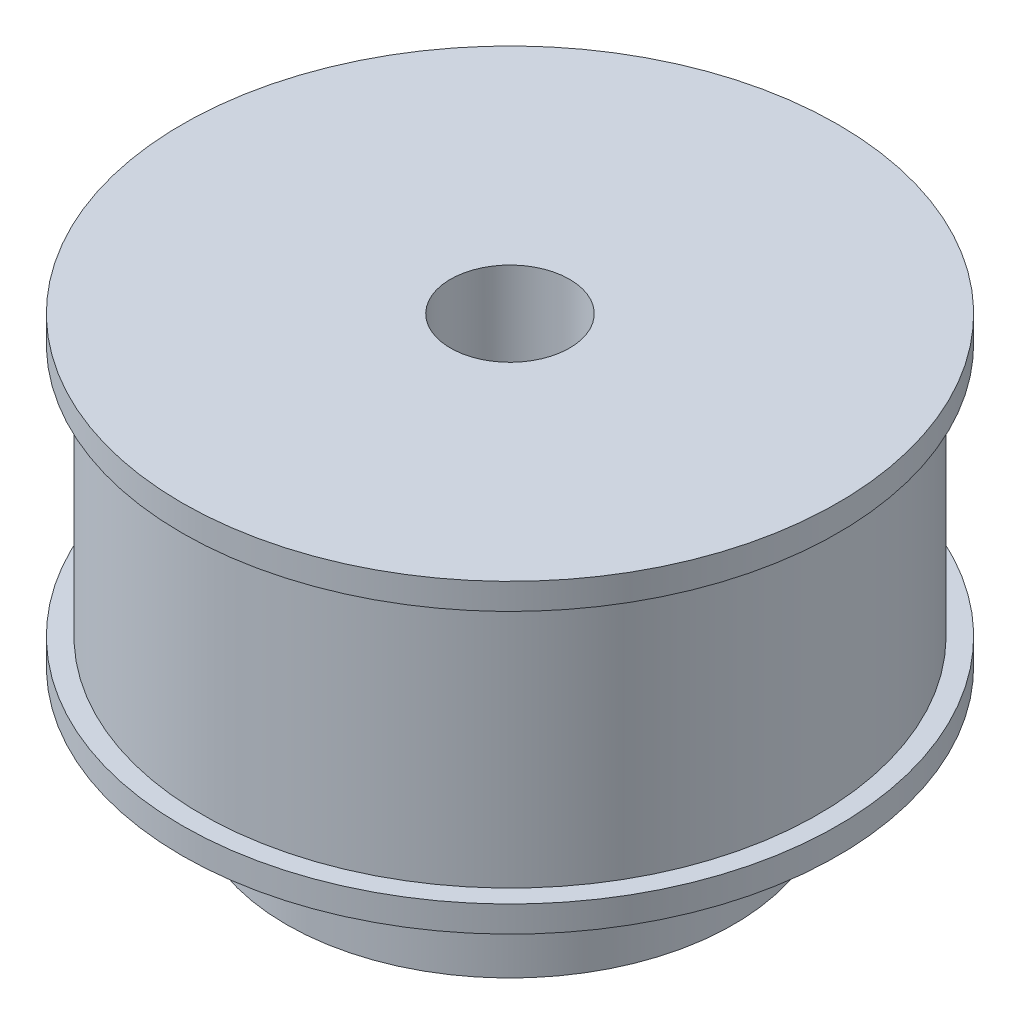
ISO-10303-21;
HEADER;
FILE_DESCRIPTION(('STEP AP214'),'2;1');
FILE_NAME('part.step','',(''),(''),'','','');
FILE_SCHEMA(('AUTOMOTIVE_DESIGN { 1 0 10303 214 1 1 1 1 }'));
ENDSEC;
DATA;
#1=APPLICATION_CONTEXT('core data for automotive mechanical design processes');
#2=APPLICATION_PROTOCOL_DEFINITION('international standard','automotive_design',2000,#1);
#3=PRODUCT_CONTEXT('',#1,'mechanical');
#4=PRODUCT('Part','Part','',(#3));
#5=PRODUCT_RELATED_PRODUCT_CATEGORY('part','',(#4));
#6=PRODUCT_DEFINITION_FORMATION('','',#4);
#7=PRODUCT_DEFINITION_CONTEXT('part definition',#1,'design');
#8=PRODUCT_DEFINITION('design','',#6,#7);
#9=PRODUCT_DEFINITION_SHAPE('','',#8);
#10=(LENGTH_UNIT() NAMED_UNIT(*) SI_UNIT(.MILLI.,.METRE.));
#11=(NAMED_UNIT(*) PLANE_ANGLE_UNIT() SI_UNIT($,.RADIAN.));
#12=(NAMED_UNIT(*) SI_UNIT($,.STERADIAN.) SOLID_ANGLE_UNIT());
#13=UNCERTAINTY_MEASURE_WITH_UNIT(LENGTH_MEASURE(1.E-05),#10,'distance_accuracy_value','');
#14=(GEOMETRIC_REPRESENTATION_CONTEXT(3) GLOBAL_UNCERTAINTY_ASSIGNED_CONTEXT((#13)) GLOBAL_UNIT_ASSIGNED_CONTEXT((#10,
#11,#12)) REPRESENTATION_CONTEXT('',''));
#15=CARTESIAN_POINT('',(0.,0.,0.));
#16=DIRECTION('',(0.,0.,1.));
#17=DIRECTION('',(1.,0.,0.));
#18=AXIS2_PLACEMENT_3D('',#15,#16,#17);
#19=CARTESIAN_POINT('',(0.,0.,0.));
#20=DIRECTION('',(0.,-1.,0.));
#21=DIRECTION('',(0.,0.,-1.));
#22=AXIS2_PLACEMENT_3D('',#19,#20,#21);
#23=CYLINDRICAL_SURFACE('',#22,4.);
#24=CARTESIAN_POINT('',(-3.46410161513775,3.75,-2.));
#25=CARTESIAN_POINT('',(-3.46411185715887,3.85421320547434,-1.99999158748781));
#26=CARTESIAN_POINT('',(-3.46887633544978,3.9585621765338,-1.99179963610437));
#27=CARTESIAN_POINT('',(-3.48724701669072,4.1640551772306,-1.95944672580053));
#28=CARTESIAN_POINT('',(-3.50087179788182,4.26519200324776,-1.93525221095662));
#29=CARTESIAN_POINT('',(-3.53498701490001,4.46090315644693,-1.8721998159803));
#30=CARTESIAN_POINT('',(-3.55544089069168,4.55550925884925,-1.83341988295963));
#31=CARTESIAN_POINT('',(-3.60085327291132,4.73684845047615,-1.74253507245138));
#32=CARTESIAN_POINT('',(-3.62581202301253,4.82358111343677,-1.69042947410139));
#33=CARTESIAN_POINT('',(-3.67993738819289,4.99461144313338,-1.569333074538));
#34=CARTESIAN_POINT('',(-3.70928127465103,5.07811826759177,-1.49930407053533));
#35=CARTESIAN_POINT('',(-3.76743965382121,5.2328167805706,-1.34650761698202));
#36=CARTESIAN_POINT('',(-3.79625387610258,5.30400232620397,-1.26373385204841));
#37=CARTESIAN_POINT('',(-3.85242953961661,5.4367343011885,-1.08097912631265));
#38=CARTESIAN_POINT('',(-3.87956212851245,5.49730753542331,-0.980214377887153));
#39=CARTESIAN_POINT('',(-3.92701512184167,5.60028170678709,-0.768314053336917));
#40=CARTESIAN_POINT('',(-3.94733982363631,5.6426941123508,-0.657185076311985));
#41=CARTESIAN_POINT('',(-3.97760922492053,5.70500932253118,-0.436089887818817));
#42=CARTESIAN_POINT('',(-3.98818960442739,5.7262990526921,-0.326603580968785));
#43=CARTESIAN_POINT('',(-4.00015167691179,5.75033223736903,-0.10514125740454));
#44=CARTESIAN_POINT('',(-4.00153893568934,5.75308691359628,0.00683321168520778));
#45=CARTESIAN_POINT('',(-3.99525963833124,5.74050665205486,0.219665048849573));
#46=CARTESIAN_POINT('',(-3.98836991784381,5.72672396895636,0.320642398354139));
#47=CARTESIAN_POINT('',(-3.96748490519435,5.68423831219188,0.518627543836089));
#48=CARTESIAN_POINT('',(-3.95348908132771,5.65553422204788,0.615635042187701));
#49=CARTESIAN_POINT('',(-3.91943166575325,5.58383486782005,0.804618783139259));
#50=CARTESIAN_POINT('',(-3.89928883058402,5.54064737365578,0.896506847030398));
#51=CARTESIAN_POINT('',(-3.8547529197337,5.4414731675971,1.07195360302662));
#52=CARTESIAN_POINT('',(-3.83035832314967,5.38548187339532,1.15550929767728));
#53=CARTESIAN_POINT('',(-3.77688788798459,5.25620929693394,1.3203473217964));
#54=CARTESIAN_POINT('',(-3.7475875199635,5.18179394334797,1.40066815005872));
#55=CARTESIAN_POINT('',(-3.68908681173623,5.02082055013965,1.54820874059556));
#56=CARTESIAN_POINT('',(-3.65988656531257,4.93425325545188,1.61541842314846));
#57=CARTESIAN_POINT('',(-3.60288312184969,4.74470361515182,1.73901066928442));
#58=CARTESIAN_POINT('',(-3.57528639981415,4.64102795389158,1.7944346299561));
#59=CARTESIAN_POINT('',(-3.52750900557151,4.424124657282,1.88663822600246));
#60=CARTESIAN_POINT('',(-3.50732060092135,4.31090713396487,1.92343731642178));
#61=CARTESIAN_POINT('',(-3.47889271634069,4.08757097743442,1.97436042205008));
#62=CARTESIAN_POINT('',(-3.46983311696993,3.9779177619129,1.99005024423995));
#63=CARTESIAN_POINT('',(-3.46235838723219,3.75719731696691,2.00303389322285));
#64=CARTESIAN_POINT('',(-3.46393573778623,3.6461311417604,2.00034071463005));
#65=CARTESIAN_POINT('',(-3.47668673081169,3.43869216284256,1.97807208668793));
#66=CARTESIAN_POINT('',(-3.48679175013308,3.34204109778421,1.96037563342492));
#67=CARTESIAN_POINT('',(-3.51388043102682,3.15326442745801,1.91139256926489));
#68=CARTESIAN_POINT('',(-3.53086632010068,3.06114029850652,1.88010155724727));
#69=CARTESIAN_POINT('',(-3.57072444159313,2.87917733819488,1.80329517720973));
#70=CARTESIAN_POINT('',(-3.59383286486125,2.78964196629395,1.7571881273853));
#71=CARTESIAN_POINT('',(-3.643122389945,2.61906145692096,1.65257412803176));
#72=CARTESIAN_POINT('',(-3.66930506710298,2.53802071296949,1.59406080866498));
#73=CARTESIAN_POINT('',(-3.72575996912669,2.37604246495734,1.45767433439709));
#74=CARTESIAN_POINT('',(-3.75613166308566,2.29640569858222,1.37829054462748));
#75=CARTESIAN_POINT('',(-3.81468469955797,2.15117552399527,1.20680899079904));
#76=CARTESIAN_POINT('',(-3.84286530015463,2.08558685947316,1.11470694931991));
#77=CARTESIAN_POINT('',(-3.89482723381867,1.96885254816729,0.917070725108058));
#78=CARTESIAN_POINT('',(-3.91847283343884,1.91813376383323,0.811246195112494));
#79=CARTESIAN_POINT('',(-3.95766709918776,1.83572419203039,0.591044729317865));
#80=CARTESIAN_POINT('',(-3.97322287353397,1.8040166963159,0.476675402917652));
#81=CARTESIAN_POINT('',(-3.99335016363174,1.76326287251486,0.253959364539763));
#82=CARTESIAN_POINT('',(-3.9987985581427,1.75240425133572,0.146022887268299));
#83=CARTESIAN_POINT('',(-4.00084260752374,1.74831346600433,-0.0702519714699464));
#84=CARTESIAN_POINT('',(-3.99744136141634,1.75507513147113,-0.178590198981615));
#85=CARTESIAN_POINT('',(-3.98267937668509,1.7848328243164,-0.385075986136859));
#86=CARTESIAN_POINT('',(-3.97185789309443,1.80672973730905,-0.483424641057419));
#87=CARTESIAN_POINT('',(-3.94384187353387,1.86465395980667,-0.674891898931565));
#88=CARTESIAN_POINT('',(-3.92664642364424,1.90068329570691,-0.768009749669772));
#89=CARTESIAN_POINT('',(-3.8865186139318,1.9874542549914,-0.950846833596741));
#90=CARTESIAN_POINT('',(-3.86337234005403,2.03875921975186,-1.0402503657229));
#91=CARTESIAN_POINT('',(-3.81376266676027,2.15391528811809,-1.20954920326828));
#92=CARTESIAN_POINT('',(-3.78729774583427,2.21777215410157,-1.28944011444319));
#93=CARTESIAN_POINT('',(-3.73057218840582,2.36359663555941,-1.44582833859495));
#94=CARTESIAN_POINT('',(-3.70019591726075,2.44673418080029,-1.52119665879199));
#95=CARTESIAN_POINT('',(-3.64126158628571,2.62489222830609,-1.65732528394006));
#96=CARTESIAN_POINT('',(-3.61270515130784,2.71992313136052,-1.71807266521244));
#97=CARTESIAN_POINT('',(-3.55999186256751,2.92330889413024,-1.82486714716811));
#98=CARTESIAN_POINT('',(-3.53600256268535,3.03198991073527,-1.87038902381914));
#99=CARTESIAN_POINT('',(-3.5069621813237,3.20057811963095,-1.92395929504801));
#100=CARTESIAN_POINT('',(-3.49844389329401,3.25764782059068,-1.93935666147967));
#101=CARTESIAN_POINT('',(-3.48406059323535,3.37323255750019,-1.96508069805043));
#102=CARTESIAN_POINT('',(-3.4781937263605,3.43174655275425,-1.97541091343282));
#103=CARTESIAN_POINT('',(-3.47059023668758,3.53360078924729,-1.9887293296122));
#104=CARTESIAN_POINT('',(-3.46816389731815,3.57673305725007,-1.99295091983786));
#105=CARTESIAN_POINT('',(-3.46491740045177,3.6632356930929,-1.99858810035606));
#106=CARTESIAN_POINT('',(-3.46409735040492,3.7066060766667,-2.00000350293331));
#107=CARTESIAN_POINT('',(-3.46410161513775,3.75,-2.));
#108=B_SPLINE_CURVE_WITH_KNOTS('',3,(#24,#25,#26,#27,#28,#29,#30,#31,#32,#33,#34,#35,#36,#37,
#38,#39,#40,#41,#42,#43,#44,#45,#46,#47,#48,#49,#50,#51,#52,#53,#54,#55,#56,#57,#58,#59,#60,#61,
#62,#63,#64,#65,#66,#67,#68,#69,#70,#71,#72,#73,#74,#75,#76,#77,#78,#79,#80,#81,#82,#83,#84,#85,
#86,#87,#88,#89,#90,#91,#92,#93,#94,#95,#96,#97,#98,#99,#100,#101,#102,#103,#104,#105,#106,
#107),.UNSPECIFIED.,.T.,.F.,(4,2,2,2,2,2,2,2,2,2,2,2,2,2,2,2,2,2,2,2,2,2,2,2,2,2,2,2,2,2,2,2,2,
2,2,2,2,2,2,2,2,4),(0.,0.312464245189431,0.62558578564961,0.937057191861537,1.24854545093097,
1.58572462503713,1.92307142172809,2.28315784481594,2.64301653931849,2.97726969939937,
3.31132047376147,3.61632194973143,3.92134625038977,4.2305906946636,4.5399459870461,
4.87854382917848,5.21740096495904,5.57777683462963,5.93777548427477,6.2692458171249,
6.60048186380813,6.89548366852118,7.19058104876193,7.49934592816242,7.80826972444161,
8.15613487165293,8.50411729960471,8.86128362829998,9.2181355962161,9.5422454078304,
9.8662417359201,10.1688884974705,10.4715786702809,10.7872150144301,11.102996602055,
11.450204837042,11.7977188569438,12.1562149808128,12.3351395323571,12.5139387197526,
12.6440387634036,12.7741475095882),.UNSPECIFIED.);
#109=CARTESIAN_POINT('',(-3.46410161513775,3.75,-2.));
#110=VERTEX_POINT('',#109);
#111=EDGE_CURVE('E77',#110,#110,#108,.T.);
#112=ORIENTED_EDGE('',*,*,#111,.F.);
#113=EDGE_LOOP('',(#112));
#114=FACE_BOUND('',#113,.T.);
#115=CARTESIAN_POINT('',(0.,5.52665455886938,-4.));
#116=CARTESIAN_POINT('',(-0.105143925902467,5.52664795423499,-3.99999426810082));
#117=CARTESIAN_POINT('',(-0.210413199395125,5.51831441262727,-3.99580982039513));
#118=CARTESIAN_POINT('',(-0.417840470537792,5.4853487981863,-3.97948312074314));
#119=CARTESIAN_POINT('',(-0.519992173427259,5.46068577287375,-3.96732575657839));
#120=CARTESIAN_POINT('',(-0.717867089760898,5.39626694163612,-3.9363255880675));
#121=CARTESIAN_POINT('',(-0.813613605878292,5.35656979037344,-3.91750878355075));
#122=CARTESIAN_POINT('',(-0.996945233613197,5.26351331613941,-3.87491553031523));
#123=CARTESIAN_POINT('',(-1.08453098798012,5.21015507037165,-3.8511394726705));
#124=CARTESIAN_POINT('',(-1.25501563552382,5.08762005989881,-3.79912516516124));
#125=CARTESIAN_POINT('',(-1.33731042224422,5.0176816003901,-3.77070398255074));
#126=CARTESIAN_POINT('',(-1.48955888973396,4.8656116003753,-3.71319940493486));
#127=CARTESIAN_POINT('',(-1.55950316621353,4.7834708553245,-3.68411552418069));
#128=CARTESIAN_POINT('',(-1.69050400090056,4.60168785982262,-3.62597902394695));
#129=CARTESIAN_POINT('',(-1.75045067110327,4.50118236217755,-3.59710373940263));
#130=CARTESIAN_POINT('',(-1.85233645378139,4.28991988689695,-3.54571957544641));
#131=CARTESIAN_POINT('',(-1.89428842993267,4.17917030142388,-3.52320615213979));
#132=CARTESIAN_POINT('',(-1.95626488437718,3.95732434802553,-3.48915734075617));
#133=CARTESIAN_POINT('',(-1.97745171416088,3.84664565473459,-3.47704543167427));
#134=CARTESIAN_POINT('',(-2.00085398661769,3.62269688331042,-3.46363779897055));
#135=CARTESIAN_POINT('',(-2.00308817674615,3.50942947712707,-3.46233138686576));
#136=CARTESIAN_POINT('',(-1.98937457434459,3.29808251023864,-3.47021860514497));
#137=CARTESIAN_POINT('',(-1.97556911907364,3.19980649642328,-3.47817527324027));
#138=CARTESIAN_POINT('',(-1.93387969811386,3.00721074012329,-3.501524574677));
#139=CARTESIAN_POINT('',(-1.9059912477953,2.91289226825875,-3.51691957663552));
#140=CARTESIAN_POINT('',(-1.83641956077201,2.72819629373806,-3.55374952825482));
#141=CARTESIAN_POINT('',(-1.79443013423199,2.6379617612978,-3.57531681327997));
#142=CARTESIAN_POINT('',(-1.698083375336,2.46538597368936,-3.62206808562807));
#143=CARTESIAN_POINT('',(-1.64372048762493,2.3830482876692,-3.64725369560381));
#144=CARTESIAN_POINT('',(-1.51613210982558,2.21761205338293,-3.70226315806571));
#145=CARTESIAN_POINT('',(-1.44138891673856,2.13574081171706,-3.73227020473492));
#146=CARTESIAN_POINT('',(-1.27911115748275,1.98518372168758,-3.79095246600814));
#147=CARTESIAN_POINT('',(-1.19157051314857,1.91650417480161,-3.81962703917602));
#148=CARTESIAN_POINT('',(-1.0010330116637,1.79128323680992,-3.87403974565928));
#149=CARTESIAN_POINT('',(-0.897507183198818,1.7354536139779,-3.89957968324014));
#150=CARTESIAN_POINT('',(-0.680932430977593,1.64246050078336,-3.94315762242484));
#151=CARTESIAN_POINT('',(-0.567891152530552,1.60528218883905,-3.96120157887106));
#152=CARTESIAN_POINT('',(-0.345532983321404,1.55370375143603,-3.98648667482871));
#153=CARTESIAN_POINT('',(-0.236683061096652,1.53767208737582,-3.9944987660262));
#154=CARTESIAN_POINT('',(-0.0175591998987035,1.5237250966004,-4.00146026918207));
#155=CARTESIAN_POINT('',(0.0927140397398172,1.52580118759044,-4.00041397442637));
#156=CARTESIAN_POINT('',(0.302465943971973,1.54706793570687,-3.9898238450687));
#157=CARTESIAN_POINT('',(0.40211881609986,1.56491962432937,-3.98094491376336));
#158=CARTESIAN_POINT('',(0.596813784603882,1.61513070265962,-3.9564434262968));
#159=CARTESIAN_POINT('',(0.691855371382174,1.64749169177637,-3.94082012668824));
#160=CARTESIAN_POINT('',(0.877777216899145,1.72665149173544,-3.90368502827176));
#161=CARTESIAN_POINT('',(0.968460794011606,1.77383665910195,-3.88201763539261));
#162=CARTESIAN_POINT('',(1.14092272339854,1.88086963016251,-3.83487948634835));
#163=CARTESIAN_POINT('',(1.22269725955318,1.94072282806017,-3.80940711133876));
#164=CARTESIAN_POINT('',(1.38353537857843,2.07817540953081,-3.75416442672396));
#165=CARTESIAN_POINT('',(1.46154415563805,2.15694029575967,-3.72421769686998));
#166=CARTESIAN_POINT('',(1.60371264223771,2.32650486142483,-3.6652478321764));
#167=CARTESIAN_POINT('',(1.66786277142375,2.41731279656522,-3.63622534800094));
#168=CARTESIAN_POINT('',(1.78341582895803,2.61394186721533,-3.58102384412979));
#169=CARTESIAN_POINT('',(1.8340509916005,2.72027709105834,-3.55505059178121));
#170=CARTESIAN_POINT('',(1.91616565186941,2.94167469401931,-3.51148144588269));
#171=CARTESIAN_POINT('',(1.94766983173403,3.05672561180316,-3.493874764435));
#172=CARTESIAN_POINT('',(1.98772337493374,3.28047500463879,-3.47123002051604));
#173=CARTESIAN_POINT('',(1.9981859928109,3.38872306573986,-3.4651476693013));
#174=CARTESIAN_POINT('',(2.0013783087524,3.60554869319843,-3.46330709283206));
#175=CARTESIAN_POINT('',(1.99411569324648,3.7141260963451,-3.4675443925278));
#176=CARTESIAN_POINT('',(1.96385225118662,3.91762156193625,-3.48475724102153));
#177=CARTESIAN_POINT('',(1.94241662868607,4.01285549915886,-3.49686188965317));
#178=CARTESIAN_POINT('',(1.88635071644882,4.19827079771811,-3.52742032375305));
#179=CARTESIAN_POINT('',(1.85171618231984,4.28845052305344,-3.54587615139337));
#180=CARTESIAN_POINT('',(1.76763149060113,4.46790426084245,-3.58857060729071));
#181=CARTESIAN_POINT('',(1.7173422756314,4.55671036252744,-3.61311444791841));
#182=CARTESIAN_POINT('',(1.60430194327478,4.7252036312319,-3.66470663269721));
#183=CARTESIAN_POINT('',(1.54154434248312,4.8048860199116,-3.69175627591221));
#184=CARTESIAN_POINT('',(1.39640665332275,4.96293852357873,-3.74924646316184));
#185=CARTESIAN_POINT('',(1.31256884599452,5.03997276356996,-3.77969966613256));
#186=CARTESIAN_POINT('',(1.13230961246639,5.17918052573992,-3.83755504519861));
#187=CARTESIAN_POINT('',(1.03588144661039,5.24134603780919,-3.8649555725239));
#188=CARTESIAN_POINT('',(0.831863193565891,5.34912728429352,-3.91396019133074));
#189=CARTESIAN_POINT('',(0.724199007553462,5.39462289734231,-3.93552192987866));
#190=CARTESIAN_POINT('',(0.501484202276174,5.4662708943842,-3.97002682597974));
#191=CARTESIAN_POINT('',(0.3864555991782,5.4924782524808,-3.98299446726135));
#192=CARTESIAN_POINT('',(0.225203892981791,5.51444938104086,-3.99390923826956));
#193=CARTESIAN_POINT('',(0.18032375888313,5.51901984060206,-3.99618730680501));
#194=CARTESIAN_POINT('',(0.0903034636101832,5.52512388989755,-3.99923393953631));
#195=CARTESIAN_POINT('',(0.0451632952932569,5.5266573958098,-4.00000246206761));
#196=CARTESIAN_POINT('',(0.,5.52665455886938,-4.));
#197=B_SPLINE_CURVE_WITH_KNOTS('',3,(#115,#116,#117,#118,#119,#120,#121,#122,#123,#124,#125,
#126,#127,#128,#129,#130,#131,#132,#133,#134,#135,#136,#137,#138,#139,#140,#141,#142,#143,#144,
#145,#146,#147,#148,#149,#150,#151,#152,#153,#154,#155,#156,#157,#158,#159,#160,#161,#162,#163,
#164,#165,#166,#167,#168,#169,#170,#171,#172,#173,#174,#175,#176,#177,#178,#179,#180,#181,#182,
#183,#184,#185,#186,#187,#188,#189,#190,#191,#192,#193,#194,#195,#196),.UNSPECIFIED.,.T.,.F.,(4,
2,2,2,2,2,2,2,2,2,2,2,2,2,2,2,2,2,2,2,2,2,2,2,2,2,2,2,2,2,2,2,2,2,2,2,2,2,2,2,4),(0.,
0.315248514840585,0.631096299418396,0.945724310984597,1.26032752116314,1.59396351743618,
1.92785247530807,2.28763452861505,2.64715895796562,2.98516024280459,3.32282714658041,
3.62011424818641,3.91749607851357,4.22180480336975,4.52625042520444,4.86929882667757,
5.21251069197373,5.57166044428881,5.93052433824559,6.25966580942691,6.58865129022952,
6.89213813012244,7.19565843261863,7.50785712055797,7.82018901496678,8.16319221288838,
8.50643177230863,8.86629364323451,9.22569023890901,9.55058615006093,9.87534119729357,
10.1691586049771,10.463070575767,10.7767291356057,11.0905512228726,11.4425048551434,
11.7946476676249,12.1492802732705,12.502898172423,12.6383056026783,12.7737167702213),.UNSPECIFIED.);
#198=CARTESIAN_POINT('',(0.,5.52665455886938,-4.));
#199=VERTEX_POINT('',#198);
#200=EDGE_CURVE('E76',#199,#199,#197,.T.);
#201=ORIENTED_EDGE('',*,*,#200,.F.);
#202=EDGE_LOOP('',(#201));
#203=FACE_BOUND('',#202,.T.);
#204=CARTESIAN_POINT('',(0.,0.,0.));
#205=DIRECTION('',(0.,-1.,0.));
#206=DIRECTION('',(0.,0.,-1.));
#207=AXIS2_PLACEMENT_3D('',#204,#205,#206);
#208=CIRCLE('',#207,4.);
#209=CARTESIAN_POINT('',(0.,0.,-4.));
#210=VERTEX_POINT('',#209);
#211=EDGE_CURVE('E10',#210,#210,#208,.T.);
#212=ORIENTED_EDGE('',*,*,#211,.T.);
#213=EDGE_LOOP('',(#212));
#214=FACE_BOUND('',#213,.T.);
#215=CARTESIAN_POINT('',(0.,28.,0.));
#216=DIRECTION('',(0.,-1.,0.));
#217=DIRECTION('',(0.,0.,-1.));
#218=AXIS2_PLACEMENT_3D('',#215,#216,#217);
#219=CIRCLE('',#218,4.);
#220=CARTESIAN_POINT('',(0.,28.,-4.));
#221=VERTEX_POINT('',#220);
#222=EDGE_CURVE('E99',#221,#221,#219,.T.);
#223=ORIENTED_EDGE('',*,*,#222,.F.);
#224=EDGE_LOOP('',(#223));
#225=FACE_BOUND('',#224,.T.);
#226=ADVANCED_FACE('F45',(#114,#203,#214,#225),#23,.F.);
#227=CARTESIAN_POINT('',(4.,0.,0.));
#228=DIRECTION('',(0.,-1.,0.));
#229=DIRECTION('',(0.,0.,-1.));
#230=AXIS2_PLACEMENT_3D('',#227,#228,#229);
#231=PLANE('',#230);
#232=CARTESIAN_POINT('',(0.,0.,0.));
#233=DIRECTION('',(0.,-1.,0.));
#234=DIRECTION('',(0.,0.,-1.));
#235=AXIS2_PLACEMENT_3D('',#232,#233,#234);
#236=CIRCLE('',#235,15.);
#237=CARTESIAN_POINT('',(0.,0.,-15.));
#238=VERTEX_POINT('',#237);
#239=EDGE_CURVE('E59',#238,#238,#236,.T.);
#240=ORIENTED_EDGE('',*,*,#239,.T.);
#241=EDGE_LOOP('',(#240));
#242=FACE_BOUND('',#241,.T.);
#243=ORIENTED_EDGE('',*,*,#211,.F.);
#244=EDGE_LOOP('',(#243));
#245=FACE_BOUND('',#244,.T.);
#246=ADVANCED_FACE('F147',(#242,#245),#231,.T.);
#247=CARTESIAN_POINT('',(0.,0.,0.));
#248=DIRECTION('',(0.,-1.,0.));
#249=DIRECTION('',(0.,0.,-1.));
#250=AXIS2_PLACEMENT_3D('',#247,#248,#249);
#251=CYLINDRICAL_SURFACE('',#250,15.);
#252=CARTESIAN_POINT('',(-14.8660687473185,3.75,-2.));
#253=CARTESIAN_POINT('',(-14.8660704451043,3.63819614453247,-1.99999528594759));
#254=CARTESIAN_POINT('',(-14.8673436464034,3.52632396688378,-1.99059326704128));
#255=CARTESIAN_POINT('',(-14.8722964859732,3.30569753766411,-1.9532379626613));
#256=CARTESIAN_POINT('',(-14.8759785863295,3.1969465950828,-1.92526569649113));
#257=CARTESIAN_POINT('',(-14.8853249214529,2.98578863177368,-1.85161311140264));
#258=CARTESIAN_POINT('',(-14.8909877556206,2.88337718838231,-1.80594530275044));
#259=CARTESIAN_POINT('',(-14.9036558225185,2.68768892429044,-1.69822564880686));
#260=CARTESIAN_POINT('',(-14.9106608397868,2.59441064106197,-1.63617643263469));
#261=CARTESIAN_POINT('',(-14.9252737732073,2.41902654533153,-1.49703370489518));
#262=CARTESIAN_POINT('',(-14.9328848849373,2.33698713432062,-1.41985682274859));
#263=CARTESIAN_POINT('',(-14.9478237625824,2.18698375454362,-1.2528292287261));
#264=CARTESIAN_POINT('',(-14.9551515139324,2.1190205085238,-1.16297786647198));
#265=CARTESIAN_POINT('',(-14.9687309976037,1.9988581582836,-0.972731724927611));
#266=CARTESIAN_POINT('',(-14.9749785650228,1.94671951070975,-0.872298437711221));
#267=CARTESIAN_POINT('',(-14.9856585341581,1.8600738358192,-0.664003816037366));
#268=CARTESIAN_POINT('',(-14.990091012146,1.82556606762232,-0.556142793922399));
#269=CARTESIAN_POINT('',(-14.9966188619561,1.77536109041973,-0.336735375014088));
#270=CARTESIAN_POINT('',(-14.9987279820508,1.75955318498804,-0.225214723469897));
#271=CARTESIAN_POINT('',(-15.0004184797152,1.74685339126318,-0.00108500230365559));
#272=CARTESIAN_POINT('',(-14.9999999696283,1.74996066226348,0.111524018722467));
#273=CARTESIAN_POINT('',(-14.9966934411691,1.77491473054095,0.33388012446577));
#274=CARTESIAN_POINT('',(-14.9938211133781,1.79664246474565,0.443640837361785));
#275=CARTESIAN_POINT('',(-14.9859472409229,1.85803432702151,0.657944122712555));
#276=CARTESIAN_POINT('',(-14.9809456511403,1.89769883516811,0.76248658454184));
#277=CARTESIAN_POINT('',(-14.9693481900416,1.99396344112182,0.963751808424129));
#278=CARTESIAN_POINT('',(-14.9627475214588,2.05061462318308,1.06044984935326));
#279=CARTESIAN_POINT('',(-14.9486895041904,2.17920725728286,1.24301169073479));
#280=CARTESIAN_POINT('',(-14.9412321108429,2.2511495066278,1.32887492586682));
#281=CARTESIAN_POINT('',(-14.9262258809566,2.40894784835893,1.48803006154539));
#282=CARTESIAN_POINT('',(-14.918676784244,2.49490776819363,1.56121903353021));
#283=CARTESIAN_POINT('',(-14.9043949876924,2.67794593137257,1.69214693057191));
#284=CARTESIAN_POINT('',(-14.8976622910907,2.77502421880297,1.74988579436353));
#285=CARTESIAN_POINT('',(-14.8857757633434,2.9776400003467,1.848282860865));
#286=CARTESIAN_POINT('',(-14.8806227621479,3.08318190451849,1.88893208906707));
#287=CARTESIAN_POINT('',(-14.8724947546572,3.29967802063838,1.95190090044924));
#288=CARTESIAN_POINT('',(-14.8695196283616,3.41063193402656,1.97422149354143));
#289=CARTESIAN_POINT('',(-14.8661064501035,3.63389133500496,1.99976160768727));
#290=CARTESIAN_POINT('',(-14.8656491151163,3.74617993033254,2.00312631098812));
#291=CARTESIAN_POINT('',(-14.867272242967,3.96971925610474,1.99104288188796));
#292=CARTESIAN_POINT('',(-14.8693526440475,4.08097001173945,1.97559520729776));
#293=CARTESIAN_POINT('',(-14.8757992043677,4.29883598640561,1.9264480503702));
#294=CARTESIAN_POINT('',(-14.8801564778765,4.4054674930181,1.8928195032336));
#295=CARTESIAN_POINT('',(-14.8906585901441,4.61157891345244,1.80833845080125));
#296=CARTESIAN_POINT('',(-14.8968034998284,4.71105854332372,1.75748526209383));
#297=CARTESIAN_POINT('',(-14.9102344661952,4.90069731044081,1.63964406417211));
#298=CARTESIAN_POINT('',(-14.9175271378913,4.99079704836824,1.572561231663));
#299=CARTESIAN_POINT('',(-14.9324114351651,5.15851093843709,1.42429832312799));
#300=CARTESIAN_POINT('',(-14.9400030739993,5.23612453614802,1.34311762143754));
#301=CARTESIAN_POINT('',(-14.9546894865533,5.37717655392112,1.16832754835824));
#302=CARTESIAN_POINT('',(-14.9617807004972,5.44051931637161,1.07464064093252));
#303=CARTESIAN_POINT('',(-14.974613414783,5.55056828217532,0.87787245231762));
#304=CARTESIAN_POINT('',(-14.9803549454849,5.59727485975611,0.774791382513699));
#305=CARTESIAN_POINT('',(-14.9898256469115,5.67256926158813,0.562472772523433));
#306=CARTESIAN_POINT('',(-14.9935608482078,5.70121142908355,0.453254784247362));
#307=CARTESIAN_POINT('',(-14.9986231668662,5.73974048546098,0.231506493423199));
#308=CARTESIAN_POINT('',(-14.9999504085613,5.74962834270771,0.118976362199824));
#309=CARTESIAN_POINT('',(-15.0000464724842,5.75034826724032,-0.105269873711588));
#310=CARTESIAN_POINT('',(-14.9988350491343,5.74132747059439,-0.21698552592188));
#311=CARTESIAN_POINT('',(-14.9940293321986,5.70479895876802,-0.437297443052353));
#312=CARTESIAN_POINT('',(-14.9904350419501,5.67729126947869,-0.545893712341047));
#313=CARTESIAN_POINT('',(-14.9812655664247,5.60461795292333,-0.75685823458886));
#314=CARTESIAN_POINT('',(-14.9756912840831,5.55946037359194,-0.859229301543911));
#315=CARTESIAN_POINT('',(-14.9631774939599,5.45278445035426,-1.05496407863087));
#316=CARTESIAN_POINT('',(-14.95623796097,5.39126580434756,-1.14832762239916));
#317=CARTESIAN_POINT('',(-14.9417029120984,5.25307331799635,-1.32414728606674));
#318=CARTESIAN_POINT('',(-14.9341029029987,5.17629020986081,-1.406517157164));
#319=CARTESIAN_POINT('',(-14.919138648968,5.00997693095264,-1.55725895587216));
#320=CARTESIAN_POINT('',(-14.9117744601021,4.92044375607874,-1.62562757530232));
#321=CARTESIAN_POINT('',(-14.8980810988492,4.73071605842911,-1.74668790978495));
#322=CARTESIAN_POINT('',(-14.8917566176026,4.6304764084899,-1.79930940429126));
#323=CARTESIAN_POINT('',(-14.8809136658427,4.42255153248295,-1.8868951828149));
#324=CARTESIAN_POINT('',(-14.8763932602426,4.31487443024063,-1.92187839666366));
#325=CARTESIAN_POINT('',(-14.8707513382361,4.13055172127446,-1.96495480378583));
#326=CARTESIAN_POINT('',(-14.8690042861798,4.05506172703186,-1.97807748135802));
#327=CARTESIAN_POINT('',(-14.866662414787,3.9030584905295,-1.99560165343181));
#328=CARTESIAN_POINT('',(-14.8660675849485,3.82654525760259,-2.00000322742319));
#329=CARTESIAN_POINT('',(-14.8660687473185,3.75,-2.));
#330=B_SPLINE_CURVE_WITH_KNOTS('',3,(#252,#253,#254,#255,#256,#257,#258,#259,#260,#261,#262,
#263,#264,#265,#266,#267,#268,#269,#270,#271,#272,#273,#274,#275,#276,#277,#278,#279,#280,#281,
#282,#283,#284,#285,#286,#287,#288,#289,#290,#291,#292,#293,#294,#295,#296,#297,#298,#299,#300,
#301,#302,#303,#304,#305,#306,#307,#308,#309,#310,#311,#312,#313,#314,#315,#316,#317,#318,#319,
#320,#321,#322,#323,#324,#325,#326,#327,#328,#329),.UNSPECIFIED.,.T.,.F.,(4,2,2,2,2,2,2,2,2,2,2,
2,2,2,2,2,2,2,2,2,2,2,2,2,2,2,2,2,2,2,2,2,2,2,2,2,2,2,4),(0.,0.335131889250449,
0.670606846105683,1.00584506276825,1.34102950834956,1.67811595121165,2.01521969762238,
2.35359556525147,2.69195721256928,3.02830569524969,3.36463922864856,3.69883808669953,
4.03304402666679,4.36826528456251,4.70350402584628,5.04134915068959,5.37919561519091,
5.71721927655741,6.05522431149102,6.3906370258193,6.72604157783542,7.06014684818595,
7.3942653761821,7.73038528142333,8.06652010750621,8.40484511764504,8.74316251675152,
9.08045723770335,9.41773454222147,9.752397098563,10.0870591862064,10.4215688535019,
10.7560846978108,11.0930874236894,11.430169684094,11.768733419821,12.1069330231324,
12.3363794094425,12.5658237044201),.UNSPECIFIED.);
#331=CARTESIAN_POINT('',(-14.8660687473185,3.75,-2.));
#332=VERTEX_POINT('',#331);
#333=EDGE_CURVE('E49',#332,#332,#330,.T.);
#334=ORIENTED_EDGE('',*,*,#333,.F.);
#335=EDGE_LOOP('',(#334));
#336=FACE_BOUND('',#335,.T.);
#337=CARTESIAN_POINT('',(0.,5.52665455886938,-15.));
#338=CARTESIAN_POINT('',(0.111808835669284,5.52664984916247,-14.9999983574254));
#339=CARTESIAN_POINT('',(0.22368597927628,5.51724702090691,-14.9987367072719));
#340=CARTESIAN_POINT('',(0.444322725138079,5.47988820981982,-14.993825111269));
#341=CARTESIAN_POINT('',(0.553079022333037,5.45191326397223,-14.9901727244172));
#342=CARTESIAN_POINT('',(0.764248312626984,5.37825284132793,-14.9808907984907));
#343=CARTESIAN_POINT('',(0.866665683058494,5.33257974783094,-14.9752626421097));
#344=CARTESIAN_POINT('',(1.0623638950303,5.2248476450631,-14.9626538666039));
#345=CARTESIAN_POINT('',(1.15564620633702,5.16279127770292,-14.9556734655857));
#346=CARTESIAN_POINT('',(1.33102582250468,5.0236412972652,-14.9410899478996));
#347=CARTESIAN_POINT('',(1.41305798549586,4.94646591386091,-14.9334835816211));
#348=CARTESIAN_POINT('',(1.56304735673102,4.77944436979272,-14.9185313755795));
#349=CARTESIAN_POINT('',(1.63100381997221,4.68959753887357,-14.9111855496234));
#350=CARTESIAN_POINT('',(1.75115902268907,4.49935543592435,-14.8975543544019));
#351=CARTESIAN_POINT('',(1.80329607482578,4.39892087639076,-14.8912731776576));
#352=CARTESIAN_POINT('',(1.8899384500729,4.19062349163259,-14.8805258737923));
#353=CARTESIAN_POINT('',(1.92444453245278,4.08276098651607,-14.8760596685121));
#354=CARTESIAN_POINT('',(1.97464606772174,3.86334874836772,-14.8694793656867));
#355=CARTESIAN_POINT('',(1.99045204228506,3.75182472433646,-14.8673514537014));
#356=CARTESIAN_POINT('',(2.00314680548117,3.52768837926343,-14.8656465160931));
#357=CARTESIAN_POINT('',(2.00003645633601,3.41507610805848,-14.866069374204));
#358=CARTESIAN_POINT('',(1.97507745939234,3.19273342884145,-14.8694055577299));
#359=CARTESIAN_POINT('',(1.95335097531762,3.08298902898367,-14.8723026462234));
#360=CARTESIAN_POINT('',(1.89196724634371,2.86871772210929,-14.8802355277475));
#361=CARTESIAN_POINT('',(1.85230959261457,2.76419093411437,-14.8852713695413));
#362=CARTESIAN_POINT('',(1.75605929143191,2.56294492416218,-14.8969326111103));
#363=CARTESIAN_POINT('',(1.69941397913749,2.46625118767507,-14.903562941239));
#364=CARTESIAN_POINT('',(1.57083393344289,2.28369547695172,-14.9176623621993));
#365=CARTESIAN_POINT('',(1.49889840502385,2.19783406631521,-14.9251314966353));
#366=CARTESIAN_POINT('',(1.34110490026362,2.03867154628748,-14.9401389923359));
#367=CARTESIAN_POINT('',(1.25514170702645,1.96547471616705,-14.947677435412));
#368=CARTESIAN_POINT('',(1.07209417013341,1.83453251394099,-14.9619192381826));
#369=CARTESIAN_POINT('',(0.975009794442369,1.77678718634586,-14.9686225954715));
#370=CARTESIAN_POINT('',(0.772392219730469,1.67838544117464,-14.9804439374358));
#371=CARTESIAN_POINT('',(0.66685557884123,1.63773602782307,-14.9855612720896));
#372=CARTESIAN_POINT('',(0.450370924336249,1.57476523989703,-14.9936282590407));
#373=CARTESIAN_POINT('',(0.339423199542257,1.55244288822998,-14.9965780268993));
#374=CARTESIAN_POINT('',(0.116166903325644,1.52689612609826,-14.9999624137686));
#375=CARTESIAN_POINT('',(0.00387503454704258,1.52352815708589,-15.0004159384905));
#376=CARTESIAN_POINT('',(-0.219671617218718,1.53560622299656,-14.9988079153852));
#377=CARTESIAN_POINT('',(-0.330926425345664,1.55105180065174,-14.996746428686));
#378=CARTESIAN_POINT('',(-0.548813715572938,1.60019921225336,-14.990351753581));
#379=CARTESIAN_POINT('',(-0.655462016512044,1.63383212719153,-14.9860271430292));
#380=CARTESIAN_POINT('',(-0.861605098793559,1.71832752480647,-14.9755900925429));
#381=CARTESIAN_POINT('',(-0.961099607015637,1.76919066488263,-14.9694775843944));
#382=CARTESIAN_POINT('',(-1.15074887861608,1.88704671445269,-14.9560983737007));
#383=CARTESIAN_POINT('',(-1.2408458143966,1.95413192458271,-14.9488251504572));
#384=CARTESIAN_POINT('',(-1.4085529469919,2.10239788809363,-14.9339572870998));
#385=CARTESIAN_POINT('',(-1.48616257662378,2.18357928138581,-14.9263626324062));
#386=CARTESIAN_POINT('',(-1.62720549423098,2.35836770150893,-14.9116490247351));
#387=CARTESIAN_POINT('',(-1.69054327608938,2.45205212560754,-14.904533487753));
#388=CARTESIAN_POINT('',(-1.80058351078814,2.6488139691503,-14.8916413300182));
#389=CARTESIAN_POINT('',(-1.84728633510346,2.75189117877975,-14.8858646793678));
#390=CARTESIAN_POINT('',(-1.92257836500746,2.96421180089707,-14.8763281178008));
#391=CARTESIAN_POINT('',(-1.95122028846795,3.07343624408018,-14.872562342326));
#392=CARTESIAN_POINT('',(-1.98974667143959,3.29519819099814,-14.8674574869829));
#393=CARTESIAN_POINT('',(-1.99963213426782,3.40773551719381,-14.8661182773134));
#394=CARTESIAN_POINT('',(-2.00034485806189,3.63197804972289,-14.8660223129545));
#395=CARTESIAN_POINT('',(-1.99132219194493,3.74368279983362,-14.8672452228252));
#396=CARTESIAN_POINT('',(-1.95479376686689,3.96397243397325,-14.872091838742));
#397=CARTESIAN_POINT('',(-1.92728801483269,4.07255731917135,-14.8757155438883));
#398=CARTESIAN_POINT('',(-1.85462310332207,4.28349824212097,-14.8849489027276));
#399=CARTESIAN_POINT('',(-1.80947220819041,4.38585716998624,-14.890557626594));
#400=CARTESIAN_POINT('',(-1.70281342759737,4.58157044269544,-14.9031304571282));
#401=CARTESIAN_POINT('',(-1.64130522630429,4.67492461362542,-14.910094589966));
#402=CARTESIAN_POINT('',(-1.50312448509508,4.85074420879779,-14.9246596718306));
#403=CARTESIAN_POINT('',(-1.42634027226901,4.93312150662451,-14.9322650575408));
#404=CARTESIAN_POINT('',(-1.26002169349824,5.08387777523092,-14.9472171900166));
#405=CARTESIAN_POINT('',(-1.17048434072978,5.15225345761963,-14.9545638756898));
#406=CARTESIAN_POINT('',(-0.980752987852823,5.2733216973359,-14.9682063513753));
#407=CARTESIAN_POINT('',(-0.880514620743966,5.32594522542462,-14.9744974642689));
#408=CARTESIAN_POINT('',(-0.672592409587329,5.41353515741446,-14.9852732065897));
#409=CARTESIAN_POINT('',(-0.56491667896989,5.44852046749424,-14.9897597692431));
#410=CARTESIAN_POINT('',(-0.380588408098418,5.49160256525456,-14.9953572174327));
#411=CARTESIAN_POINT('',(-0.305091081955778,5.50472780239302,-14.9970896363507));
#412=CARTESIAN_POINT('',(-0.153073171616111,5.52225537303485,-14.9994115849077));
#413=CARTESIAN_POINT('',(-0.07655259645124,5.52665778348298,-15.000001124628));
#414=CARTESIAN_POINT('',(0.,5.52665455886938,-15.));
#415=B_SPLINE_CURVE_WITH_KNOTS('',3,(#337,#338,#339,#340,#341,#342,#343,#344,#345,#346,#347,
#348,#349,#350,#351,#352,#353,#354,#355,#356,#357,#358,#359,#360,#361,#362,#363,#364,#365,#366,
#367,#368,#369,#370,#371,#372,#373,#374,#375,#376,#377,#378,#379,#380,#381,#382,#383,#384,#385,
#386,#387,#388,#389,#390,#391,#392,#393,#394,#395,#396,#397,#398,#399,#400,#401,#402,#403,#404,
#405,#406,#407,#408,#409,#410,#411,#412,#413,#414),.UNSPECIFIED.,.T.,.F.,(4,2,2,2,2,2,2,2,2,2,2,
2,2,2,2,2,2,2,2,2,2,2,2,2,2,2,2,2,2,2,2,2,2,2,2,2,2,2,4),(0.,0.335146851305743,
0.670636430885044,1.0058916928274,1.34109292564035,1.67815978443559,2.01524447904836,
2.35362721511647,2.69199537766204,3.02835355914359,3.3646964092492,3.69884885098043,
4.0330089117585,4.36821583137897,4.70344018443797,5.04130544484849,5.37917167852296,
5.71717620202538,6.05516270391743,6.39058584992061,6.72600084354478,7.06015363396463,
7.39431917503546,7.73043274769884,8.06656158258761,8.4048770453545,8.74318495273048,
9.08050074735454,9.41779849783634,9.75242927496624,10.0870599266875,10.4215340370262,
10.756014605959,11.0930366783511,11.4301378125116,11.7686952667452,12.1068890499242,
12.3363573904731,12.5658237068544),.UNSPECIFIED.);
#416=CARTESIAN_POINT('',(0.,5.52665455886938,-15.));
#417=VERTEX_POINT('',#416);
#418=EDGE_CURVE('E69',#417,#417,#415,.T.);
#419=ORIENTED_EDGE('',*,*,#418,.F.);
#420=EDGE_LOOP('',(#419));
#421=FACE_BOUND('',#420,.T.);
#422=CARTESIAN_POINT('',(0.,7.5,0.));
#423=DIRECTION('',(0.,-1.,0.));
#424=DIRECTION('',(0.,0.,-1.));
#425=AXIS2_PLACEMENT_3D('',#422,#423,#424);
#426=CIRCLE('',#425,15.);
#427=CARTESIAN_POINT('',(0.,7.5,-15.));
#428=VERTEX_POINT('',#427);
#429=EDGE_CURVE('E66',#428,#428,#426,.T.);
#430=ORIENTED_EDGE('',*,*,#429,.T.);
#431=EDGE_LOOP('',(#430));
#432=FACE_BOUND('',#431,.T.);
#433=ORIENTED_EDGE('',*,*,#239,.F.);
#434=EDGE_LOOP('',(#433));
#435=FACE_BOUND('',#434,.T.);
#436=ADVANCED_FACE('F78',(#336,#421,#432,#435),#251,.T.);
#437=CARTESIAN_POINT('',(15.,7.5,0.));
#438=DIRECTION('',(0.,-1.,0.));
#439=DIRECTION('',(0.,0.,-1.));
#440=AXIS2_PLACEMENT_3D('',#437,#438,#439);
#441=PLANE('',#440);
#442=CARTESIAN_POINT('',(0.,7.5,0.));
#443=DIRECTION('',(0.,-1.,0.));
#444=DIRECTION('',(0.,0.,-1.));
#445=AXIS2_PLACEMENT_3D('',#442,#443,#444);
#446=CIRCLE('',#445,22.);
#447=CARTESIAN_POINT('',(0.,7.5,-22.));
#448=VERTEX_POINT('',#447);
#449=EDGE_CURVE('E126',#448,#448,#446,.T.);
#450=ORIENTED_EDGE('',*,*,#449,.T.);
#451=EDGE_LOOP('',(#450));
#452=FACE_BOUND('',#451,.T.);
#453=ORIENTED_EDGE('',*,*,#429,.F.);
#454=EDGE_LOOP('',(#453));
#455=FACE_BOUND('',#454,.T.);
#456=ADVANCED_FACE('F136',(#452,#455),#441,.T.);
#457=CARTESIAN_POINT('',(0.,0.,0.));
#458=DIRECTION('',(0.,-1.,0.));
#459=DIRECTION('',(0.,0.,-1.));
#460=AXIS2_PLACEMENT_3D('',#457,#458,#459);
#461=CYLINDRICAL_SURFACE('',#460,22.);
#462=CARTESIAN_POINT('',(0.,9.24999999999999,0.));
#463=DIRECTION('',(0.,-1.,0.));
#464=DIRECTION('',(0.,0.,-1.));
#465=AXIS2_PLACEMENT_3D('',#462,#463,#464);
#466=CIRCLE('',#465,22.);
#467=CARTESIAN_POINT('',(0.,9.24999999999999,-22.));
#468=VERTEX_POINT('',#467);
#469=EDGE_CURVE('E122',#468,#468,#466,.T.);
#470=ORIENTED_EDGE('',*,*,#469,.T.);
#471=EDGE_LOOP('',(#470));
#472=FACE_BOUND('',#471,.T.);
#473=ORIENTED_EDGE('',*,*,#449,.F.);
#474=EDGE_LOOP('',(#473));
#475=FACE_BOUND('',#474,.T.);
#476=ADVANCED_FACE('F138',(#472,#475),#461,.T.);
#477=CARTESIAN_POINT('',(22.,9.24999999999999,0.));
#478=DIRECTION('',(0.,1.,0.));
#479=DIRECTION('',(0.,0.,1.));
#480=AXIS2_PLACEMENT_3D('',#477,#478,#479);
#481=PLANE('',#480);
#482=CARTESIAN_POINT('',(0.,9.24999999999999,0.));
#483=DIRECTION('',(0.,-1.,0.));
#484=DIRECTION('',(0.,0.,-1.));
#485=AXIS2_PLACEMENT_3D('',#482,#483,#484);
#486=CIRCLE('',#485,20.69);
#487=CARTESIAN_POINT('',(0.,9.24999999999999,-20.69));
#488=VERTEX_POINT('',#487);
#489=EDGE_CURVE('E118',#488,#488,#486,.T.);
#490=ORIENTED_EDGE('',*,*,#489,.T.);
#491=EDGE_LOOP('',(#490));
#492=FACE_BOUND('',#491,.T.);
#493=ORIENTED_EDGE('',*,*,#469,.F.);
#494=EDGE_LOOP('',(#493));
#495=FACE_BOUND('',#494,.T.);
#496=ADVANCED_FACE('F144',(#492,#495),#481,.T.);
#497=CARTESIAN_POINT('',(0.,0.,0.));
#498=DIRECTION('',(0.,-1.,0.));
#499=DIRECTION('',(0.,0.,-1.));
#500=AXIS2_PLACEMENT_3D('',#497,#498,#499);
#501=CYLINDRICAL_SURFACE('',#500,20.69);
#502=CARTESIAN_POINT('',(0.,26.25,0.));
#503=DIRECTION('',(0.,-1.,0.));
#504=DIRECTION('',(0.,0.,-1.));
#505=AXIS2_PLACEMENT_3D('',#502,#503,#504);
#506=CIRCLE('',#505,20.69);
#507=CARTESIAN_POINT('',(0.,26.25,-20.69));
#508=VERTEX_POINT('',#507);
#509=EDGE_CURVE('E114',#508,#508,#506,.T.);
#510=ORIENTED_EDGE('',*,*,#509,.T.);
#511=EDGE_LOOP('',(#510));
#512=FACE_BOUND('',#511,.T.);
#513=ORIENTED_EDGE('',*,*,#489,.F.);
#514=EDGE_LOOP('',(#513));
#515=FACE_BOUND('',#514,.T.);
#516=ADVANCED_FACE('F174',(#512,#515),#501,.T.);
#517=CARTESIAN_POINT('',(20.69,26.25,0.));
#518=DIRECTION('',(0.,-1.,0.));
#519=DIRECTION('',(0.,0.,-1.));
#520=AXIS2_PLACEMENT_3D('',#517,#518,#519);
#521=PLANE('',#520);
#522=CARTESIAN_POINT('',(0.,26.25,0.));
#523=DIRECTION('',(0.,-1.,0.));
#524=DIRECTION('',(0.,0.,-1.));
#525=AXIS2_PLACEMENT_3D('',#522,#523,#524);
#526=CIRCLE('',#525,22.);
#527=CARTESIAN_POINT('',(0.,26.25,-22.));
#528=VERTEX_POINT('',#527);
#529=EDGE_CURVE('E110',#528,#528,#526,.T.);
#530=ORIENTED_EDGE('',*,*,#529,.T.);
#531=EDGE_LOOP('',(#530));
#532=FACE_BOUND('',#531,.T.);
#533=ORIENTED_EDGE('',*,*,#509,.F.);
#534=EDGE_LOOP('',(#533));
#535=FACE_BOUND('',#534,.T.);
#536=ADVANCED_FACE('F169',(#532,#535),#521,.T.);
#537=CARTESIAN_POINT('',(0.,0.,0.));
#538=DIRECTION('',(0.,-1.,0.));
#539=DIRECTION('',(0.,0.,-1.));
#540=AXIS2_PLACEMENT_3D('',#537,#538,#539);
#541=CYLINDRICAL_SURFACE('',#540,22.);
#542=CARTESIAN_POINT('',(0.,28.,0.));
#543=DIRECTION('',(0.,-1.,0.));
#544=DIRECTION('',(0.,0.,-1.));
#545=AXIS2_PLACEMENT_3D('',#542,#543,#544);
#546=CIRCLE('',#545,22.);
#547=CARTESIAN_POINT('',(0.,28.,-22.));
#548=VERTEX_POINT('',#547);
#549=EDGE_CURVE('E106',#548,#548,#546,.T.);
#550=ORIENTED_EDGE('',*,*,#549,.T.);
#551=EDGE_LOOP('',(#550));
#552=FACE_BOUND('',#551,.T.);
#553=ORIENTED_EDGE('',*,*,#529,.F.);
#554=EDGE_LOOP('',(#553));
#555=FACE_BOUND('',#554,.T.);
#556=ADVANCED_FACE('F164',(#552,#555),#541,.T.);
#557=CARTESIAN_POINT('',(22.,28.,0.));
#558=DIRECTION('',(0.,1.,0.));
#559=DIRECTION('',(0.,0.,1.));
#560=AXIS2_PLACEMENT_3D('',#557,#558,#559);
#561=PLANE('',#560);
#562=ORIENTED_EDGE('',*,*,#222,.T.);
#563=EDGE_LOOP('',(#562));
#564=FACE_BOUND('',#563,.T.);
#565=ORIENTED_EDGE('',*,*,#549,.F.);
#566=EDGE_LOOP('',(#565));
#567=FACE_BOUND('',#566,.T.);
#568=ADVANCED_FACE('F86',(#564,#567),#561,.T.);
#569=CARTESIAN_POINT('',(0.,3.52665455886938,-18.));
#570=DIRECTION('',(0.,0.,1.));
#571=DIRECTION('',(1.,0.,0.));
#572=AXIS2_PLACEMENT_3D('',#569,#570,#571);
#573=CYLINDRICAL_SURFACE('',#572,2.);
#574=ORIENTED_EDGE('',*,*,#200,.T.);
#575=EDGE_LOOP('',(#574));
#576=FACE_BOUND('',#575,.T.);
#577=ORIENTED_EDGE('',*,*,#418,.T.);
#578=EDGE_LOOP('',(#577));
#579=FACE_BOUND('',#578,.T.);
#580=ADVANCED_FACE('F81',(#576,#579),#573,.F.);
#581=CARTESIAN_POINT('',(-18.,3.75,0.));
#582=DIRECTION('',(1.,0.,0.));
#583=DIRECTION('',(0.,0.,-1.));
#584=AXIS2_PLACEMENT_3D('',#581,#582,#583);
#585=CYLINDRICAL_SURFACE('',#584,2.);
#586=ORIENTED_EDGE('',*,*,#111,.T.);
#587=EDGE_LOOP('',(#586));
#588=FACE_BOUND('',#587,.T.);
#589=ORIENTED_EDGE('',*,*,#333,.T.);
#590=EDGE_LOOP('',(#589));
#591=FACE_BOUND('',#590,.T.);
#592=ADVANCED_FACE('F85',(#588,#591),#585,.F.);
#593=CLOSED_SHELL('',(#226,#246,#436,#456,#476,#496,#516,#536,#556,#568,#580,#592));
#594=MANIFOLD_SOLID_BREP('B2',#593);
#595=ADVANCED_BREP_SHAPE_REPRESENTATION('',(#18,#594),#14);
#596=SHAPE_DEFINITION_REPRESENTATION(#9,#595);
ENDSEC;
END-ISO-10303-21;
